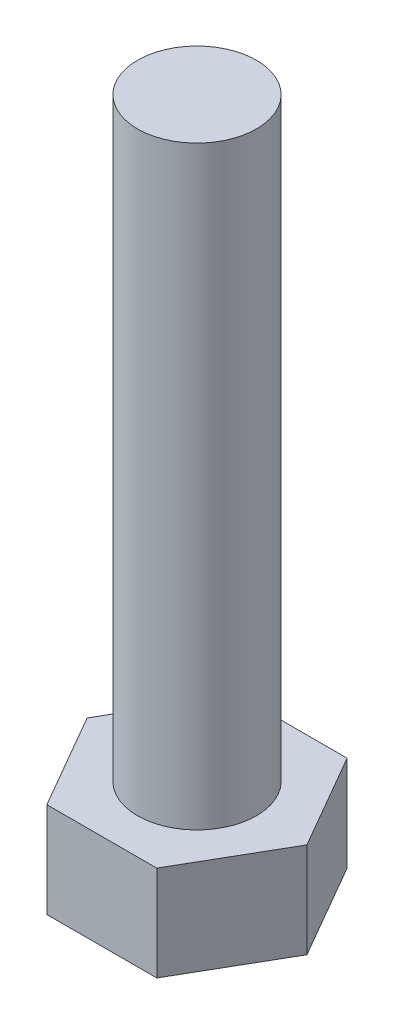
ISO-10303-21;
HEADER;
FILE_DESCRIPTION(('STEP AP214'),'2;1');
FILE_NAME('part.step','',(''),(''),'','','');
FILE_SCHEMA(('AUTOMOTIVE_DESIGN { 1 0 10303 214 1 1 1 1 }'));
ENDSEC;
DATA;
#1=APPLICATION_CONTEXT('core data for automotive mechanical design processes');
#2=APPLICATION_PROTOCOL_DEFINITION('international standard','automotive_design',2000,#1);
#3=PRODUCT_CONTEXT('',#1,'mechanical');
#4=PRODUCT('Part','Part','',(#3));
#5=PRODUCT_RELATED_PRODUCT_CATEGORY('part','',(#4));
#6=PRODUCT_DEFINITION_FORMATION('','',#4);
#7=PRODUCT_DEFINITION_CONTEXT('part definition',#1,'design');
#8=PRODUCT_DEFINITION('design','',#6,#7);
#9=PRODUCT_DEFINITION_SHAPE('','',#8);
#10=(LENGTH_UNIT() NAMED_UNIT(*) SI_UNIT(.MILLI.,.METRE.));
#11=(NAMED_UNIT(*) PLANE_ANGLE_UNIT() SI_UNIT($,.RADIAN.));
#12=(NAMED_UNIT(*) SI_UNIT($,.STERADIAN.) SOLID_ANGLE_UNIT());
#13=UNCERTAINTY_MEASURE_WITH_UNIT(LENGTH_MEASURE(1.E-05),#10,'distance_accuracy_value','');
#14=(GEOMETRIC_REPRESENTATION_CONTEXT(3) GLOBAL_UNCERTAINTY_ASSIGNED_CONTEXT((#13)) GLOBAL_UNIT_ASSIGNED_CONTEXT((#10,
#11,#12)) REPRESENTATION_CONTEXT('',''));
#15=CARTESIAN_POINT('',(0.,0.,0.));
#16=DIRECTION('',(0.,0.,1.));
#17=DIRECTION('',(1.,0.,0.));
#18=AXIS2_PLACEMENT_3D('',#15,#16,#17);
#19=CARTESIAN_POINT('',(2.3094010767585,4.,4.00000000000001));
#20=DIRECTION('',(-0.866025403784438,0.,-0.5));
#21=DIRECTION('',(-0.5,0.,0.866025403784439));
#22=AXIS2_PLACEMENT_3D('',#19,#20,#21);
#23=PLANE('',#22);
#24=DIRECTION('',(0.5,0.,-0.866025403784438));
#25=VECTOR('',#24,1.);
#26=CARTESIAN_POINT('',(2.3094010767585,0.,4.00000000000001));
#27=LINE('',#26,#25);
#28=CARTESIAN_POINT('',(2.3094010767585,0.,4.00000000000001));
#29=VERTEX_POINT('',#28);
#30=CARTESIAN_POINT('',(4.61880215351701,0.,0.));
#31=VERTEX_POINT('',#30);
#32=EDGE_CURVE('E119',#29,#31,#27,.T.);
#33=ORIENTED_EDGE('',*,*,#32,.T.);
#34=DIRECTION('',(0.,-1.,0.));
#35=VECTOR('',#34,1.);
#36=CARTESIAN_POINT('',(4.61880215351701,4.,0.));
#37=LINE('',#36,#35);
#38=CARTESIAN_POINT('',(4.61880215351701,4.,0.));
#39=VERTEX_POINT('',#38);
#40=EDGE_CURVE('E36',#39,#31,#37,.T.);
#41=ORIENTED_EDGE('',*,*,#40,.F.);
#42=DIRECTION('',(0.5,0.,-0.866025403784438));
#43=VECTOR('',#42,1.);
#44=CARTESIAN_POINT('',(2.3094010767585,4.,4.00000000000001));
#45=LINE('',#44,#43);
#46=CARTESIAN_POINT('',(2.3094010767585,4.,4.00000000000001));
#47=VERTEX_POINT('',#46);
#48=EDGE_CURVE('E130',#47,#39,#45,.T.);
#49=ORIENTED_EDGE('',*,*,#48,.F.);
#50=DIRECTION('',(0.,-1.,0.));
#51=VECTOR('',#50,1.);
#52=CARTESIAN_POINT('',(2.3094010767585,4.,4.00000000000001));
#53=LINE('',#52,#51);
#54=EDGE_CURVE('E115',#47,#29,#53,.T.);
#55=ORIENTED_EDGE('',*,*,#54,.T.);
#56=EDGE_LOOP('',(#33,#41,#49,#55));
#57=FACE_BOUND('',#56,.T.);
#58=ADVANCED_FACE('F33',(#57),#23,.F.);
#59=CARTESIAN_POINT('',(4.61880215351701,4.,0.));
#60=DIRECTION('',(-0.866025403784439,0.,0.5));
#61=DIRECTION('',(0.5,0.,0.866025403784439));
#62=AXIS2_PLACEMENT_3D('',#59,#60,#61);
#63=PLANE('',#62);
#64=DIRECTION('',(-0.5,0.,-0.866025403784439));
#65=VECTOR('',#64,1.);
#66=CARTESIAN_POINT('',(4.61880215351701,0.,0.));
#67=LINE('',#66,#65);
#68=CARTESIAN_POINT('',(2.3094010767585,0.,-4.00000000000002));
#69=VERTEX_POINT('',#68);
#70=EDGE_CURVE('E122',#31,#69,#67,.T.);
#71=ORIENTED_EDGE('',*,*,#70,.T.);
#72=DIRECTION('',(0.,-1.,0.));
#73=VECTOR('',#72,1.);
#74=CARTESIAN_POINT('',(2.3094010767585,4.,-4.00000000000002));
#75=LINE('',#74,#73);
#76=CARTESIAN_POINT('',(2.3094010767585,4.,-4.00000000000002));
#77=VERTEX_POINT('',#76);
#78=EDGE_CURVE('E133',#77,#69,#75,.T.);
#79=ORIENTED_EDGE('',*,*,#78,.F.);
#80=DIRECTION('',(-0.5,0.,-0.866025403784439));
#81=VECTOR('',#80,1.);
#82=CARTESIAN_POINT('',(4.61880215351701,4.,0.));
#83=LINE('',#82,#81);
#84=EDGE_CURVE('E88',#39,#77,#83,.T.);
#85=ORIENTED_EDGE('',*,*,#84,.F.);
#86=ORIENTED_EDGE('',*,*,#40,.T.);
#87=EDGE_LOOP('',(#71,#79,#85,#86));
#88=FACE_BOUND('',#87,.T.);
#89=ADVANCED_FACE('F138',(#88),#63,.F.);
#90=CARTESIAN_POINT('',(2.3094010767585,4.,-4.00000000000002));
#91=DIRECTION('',(0.,0.,1.));
#92=DIRECTION('',(1.,0.,0.));
#93=AXIS2_PLACEMENT_3D('',#90,#91,#92);
#94=PLANE('',#93);
#95=DIRECTION('',(-1.,0.,0.));
#96=VECTOR('',#95,1.);
#97=CARTESIAN_POINT('',(2.3094010767585,0.,-4.00000000000002));
#98=LINE('',#97,#96);
#99=CARTESIAN_POINT('',(-2.30940107675851,0.,-4.00000000000002));
#100=VERTEX_POINT('',#99);
#101=EDGE_CURVE('E125',#69,#100,#98,.T.);
#102=ORIENTED_EDGE('',*,*,#101,.T.);
#103=DIRECTION('',(0.,-1.,0.));
#104=VECTOR('',#103,1.);
#105=CARTESIAN_POINT('',(-2.30940107675851,4.,-4.00000000000002));
#106=LINE('',#105,#104);
#107=CARTESIAN_POINT('',(-2.30940107675851,4.,-4.00000000000002));
#108=VERTEX_POINT('',#107);
#109=EDGE_CURVE('E110',#108,#100,#106,.T.);
#110=ORIENTED_EDGE('',*,*,#109,.F.);
#111=DIRECTION('',(-1.,0.,0.));
#112=VECTOR('',#111,1.);
#113=CARTESIAN_POINT('',(2.3094010767585,4.,-4.00000000000002));
#114=LINE('',#113,#112);
#115=EDGE_CURVE('E101',#77,#108,#114,.T.);
#116=ORIENTED_EDGE('',*,*,#115,.F.);
#117=ORIENTED_EDGE('',*,*,#78,.T.);
#118=EDGE_LOOP('',(#102,#110,#116,#117));
#119=FACE_BOUND('',#118,.T.);
#120=ADVANCED_FACE('F144',(#119),#94,.F.);
#121=CARTESIAN_POINT('',(-2.30940107675851,4.,-4.00000000000002));
#122=DIRECTION('',(0.866025403784439,0.,0.499999999999999));
#123=DIRECTION('',(0.499999999999999,0.,-0.866025403784439));
#124=AXIS2_PLACEMENT_3D('',#121,#122,#123);
#125=PLANE('',#124);
#126=DIRECTION('',(-0.499999999999999,0.,0.866025403784439));
#127=VECTOR('',#126,1.);
#128=CARTESIAN_POINT('',(-2.30940107675851,0.,-4.00000000000002));
#129=LINE('',#128,#127);
#130=CARTESIAN_POINT('',(-4.61880215351702,0.,0.));
#131=VERTEX_POINT('',#130);
#132=EDGE_CURVE('E109',#100,#131,#129,.T.);
#133=ORIENTED_EDGE('',*,*,#132,.T.);
#134=DIRECTION('',(0.,-1.,0.));
#135=VECTOR('',#134,1.);
#136=CARTESIAN_POINT('',(-4.61880215351702,4.,0.));
#137=LINE('',#136,#135);
#138=CARTESIAN_POINT('',(-4.61880215351702,4.,0.));
#139=VERTEX_POINT('',#138);
#140=EDGE_CURVE('E106',#139,#131,#137,.T.);
#141=ORIENTED_EDGE('',*,*,#140,.F.);
#142=DIRECTION('',(-0.499999999999999,0.,0.866025403784439));
#143=VECTOR('',#142,1.);
#144=CARTESIAN_POINT('',(-2.30940107675851,4.,-4.00000000000002));
#145=LINE('',#144,#143);
#146=EDGE_CURVE('E95',#108,#139,#145,.T.);
#147=ORIENTED_EDGE('',*,*,#146,.F.);
#148=ORIENTED_EDGE('',*,*,#109,.T.);
#149=EDGE_LOOP('',(#133,#141,#147,#148));
#150=FACE_BOUND('',#149,.T.);
#151=ADVANCED_FACE('F107',(#150),#125,.F.);
#152=CARTESIAN_POINT('',(-4.61880215351702,4.,0.));
#153=DIRECTION('',(0.866025403784439,0.,-0.5));
#154=DIRECTION('',(-0.5,0.,-0.866025403784439));
#155=AXIS2_PLACEMENT_3D('',#152,#153,#154);
#156=PLANE('',#155);
#157=DIRECTION('',(0.5,0.,0.866025403784439));
#158=VECTOR('',#157,1.);
#159=CARTESIAN_POINT('',(-4.61880215351702,0.,0.));
#160=LINE('',#159,#158);
#161=CARTESIAN_POINT('',(-2.30940107675851,0.,4.00000000000001));
#162=VERTEX_POINT('',#161);
#163=EDGE_CURVE('E73',#131,#162,#160,.T.);
#164=ORIENTED_EDGE('',*,*,#163,.T.);
#165=DIRECTION('',(0.,-1.,0.));
#166=VECTOR('',#165,1.);
#167=CARTESIAN_POINT('',(-2.30940107675851,4.,4.00000000000001));
#168=LINE('',#167,#166);
#169=CARTESIAN_POINT('',(-2.30940107675851,4.,4.00000000000001));
#170=VERTEX_POINT('',#169);
#171=EDGE_CURVE('E111',#170,#162,#168,.T.);
#172=ORIENTED_EDGE('',*,*,#171,.F.);
#173=DIRECTION('',(0.5,0.,0.866025403784439));
#174=VECTOR('',#173,1.);
#175=CARTESIAN_POINT('',(-4.61880215351702,4.,0.));
#176=LINE('',#175,#174);
#177=EDGE_CURVE('E99',#139,#170,#176,.T.);
#178=ORIENTED_EDGE('',*,*,#177,.F.);
#179=ORIENTED_EDGE('',*,*,#140,.T.);
#180=EDGE_LOOP('',(#164,#172,#178,#179));
#181=FACE_BOUND('',#180,.T.);
#182=ADVANCED_FACE('F113',(#181),#156,.F.);
#183=CARTESIAN_POINT('',(-2.30940107675851,4.,4.00000000000001));
#184=DIRECTION('',(0.,0.,-1.));
#185=DIRECTION('',(-1.,0.,0.));
#186=AXIS2_PLACEMENT_3D('',#183,#184,#185);
#187=PLANE('',#186);
#188=DIRECTION('',(1.,0.,0.));
#189=VECTOR('',#188,1.);
#190=CARTESIAN_POINT('',(-2.30940107675851,0.,4.00000000000001));
#191=LINE('',#190,#189);
#192=EDGE_CURVE('E79',#162,#29,#191,.T.);
#193=ORIENTED_EDGE('',*,*,#192,.T.);
#194=ORIENTED_EDGE('',*,*,#54,.F.);
#195=DIRECTION('',(1.,0.,0.));
#196=VECTOR('',#195,1.);
#197=CARTESIAN_POINT('',(-2.30940107675851,4.,4.00000000000001));
#198=LINE('',#197,#196);
#199=EDGE_CURVE('E50',#170,#47,#198,.T.);
#200=ORIENTED_EDGE('',*,*,#199,.F.);
#201=ORIENTED_EDGE('',*,*,#171,.T.);
#202=EDGE_LOOP('',(#193,#194,#200,#201));
#203=FACE_BOUND('',#202,.T.);
#204=ADVANCED_FACE('F160',(#203),#187,.F.);
#205=CARTESIAN_POINT('',(0.,4.,0.));
#206=DIRECTION('',(0.,1.,0.));
#207=DIRECTION('',(0.,0.,1.));
#208=AXIS2_PLACEMENT_3D('',#205,#206,#207);
#209=PLANE('',#208);
#210=CARTESIAN_POINT('',(0.,4.,0.));
#211=DIRECTION('',(0.,1.,0.));
#212=DIRECTION('',(0.,0.,1.));
#213=AXIS2_PLACEMENT_3D('',#210,#211,#212);
#214=CIRCLE('',#213,2.5);
#215=CARTESIAN_POINT('',(0.,4.,2.5));
#216=VERTEX_POINT('',#215);
#217=EDGE_CURVE('E11',#216,#216,#214,.T.);
#218=ORIENTED_EDGE('',*,*,#217,.F.);
#219=EDGE_LOOP('',(#218));
#220=FACE_BOUND('',#219,.T.);
#221=ORIENTED_EDGE('',*,*,#48,.T.);
#222=ORIENTED_EDGE('',*,*,#84,.T.);
#223=ORIENTED_EDGE('',*,*,#115,.T.);
#224=ORIENTED_EDGE('',*,*,#146,.T.);
#225=ORIENTED_EDGE('',*,*,#177,.T.);
#226=ORIENTED_EDGE('',*,*,#199,.T.);
#227=EDGE_LOOP('',(#221,#222,#223,#224,#225,#226));
#228=FACE_BOUND('',#227,.T.);
#229=ADVANCED_FACE('F97',(#220,#228),#209,.T.);
#230=CARTESIAN_POINT('',(0.,0.,0.));
#231=DIRECTION('',(0.,1.,0.));
#232=DIRECTION('',(0.,0.,1.));
#233=AXIS2_PLACEMENT_3D('',#230,#231,#232);
#234=PLANE('',#233);
#235=ORIENTED_EDGE('',*,*,#32,.F.);
#236=ORIENTED_EDGE('',*,*,#192,.F.);
#237=ORIENTED_EDGE('',*,*,#163,.F.);
#238=ORIENTED_EDGE('',*,*,#132,.F.);
#239=ORIENTED_EDGE('',*,*,#101,.F.);
#240=ORIENTED_EDGE('',*,*,#70,.F.);
#241=EDGE_LOOP('',(#235,#236,#237,#238,#239,#240));
#242=FACE_BOUND('',#241,.T.);
#243=ADVANCED_FACE('F143',(#242),#234,.F.);
#244=CARTESIAN_POINT('',(0.,29.,0.));
#245=DIRECTION('',(0.,-1.,0.));
#246=DIRECTION('',(0.,0.,-1.));
#247=AXIS2_PLACEMENT_3D('',#244,#245,#246);
#248=CYLINDRICAL_SURFACE('',#247,2.5);
#249=CARTESIAN_POINT('',(0.,29.,0.));
#250=DIRECTION('',(0.,1.,0.));
#251=DIRECTION('',(0.,0.,1.));
#252=AXIS2_PLACEMENT_3D('',#249,#250,#251);
#253=CIRCLE('',#252,2.5);
#254=CARTESIAN_POINT('',(0.,29.,2.5));
#255=VERTEX_POINT('',#254);
#256=EDGE_CURVE('E123',#255,#255,#253,.T.);
#257=ORIENTED_EDGE('',*,*,#256,.F.);
#258=EDGE_LOOP('',(#257));
#259=FACE_BOUND('',#258,.T.);
#260=ORIENTED_EDGE('',*,*,#217,.T.);
#261=EDGE_LOOP('',(#260));
#262=FACE_BOUND('',#261,.T.);
#263=ADVANCED_FACE('F153',(#259,#262),#248,.T.);
#264=CARTESIAN_POINT('',(0.,29.,0.));
#265=DIRECTION('',(0.,1.,0.));
#266=DIRECTION('',(0.,0.,1.));
#267=AXIS2_PLACEMENT_3D('',#264,#265,#266);
#268=PLANE('',#267);
#269=ORIENTED_EDGE('',*,*,#256,.T.);
#270=EDGE_LOOP('',(#269));
#271=FACE_BOUND('',#270,.T.);
#272=ADVANCED_FACE('F151',(#271),#268,.T.);
#273=CLOSED_SHELL('',(#58,#89,#120,#151,#182,#204,#229,#243,#263,#272));
#274=MANIFOLD_SOLID_BREP('B2',#273);
#275=ADVANCED_BREP_SHAPE_REPRESENTATION('',(#18,#274),#14);
#276=SHAPE_DEFINITION_REPRESENTATION(#9,#275);
ENDSEC;
END-ISO-10303-21;
